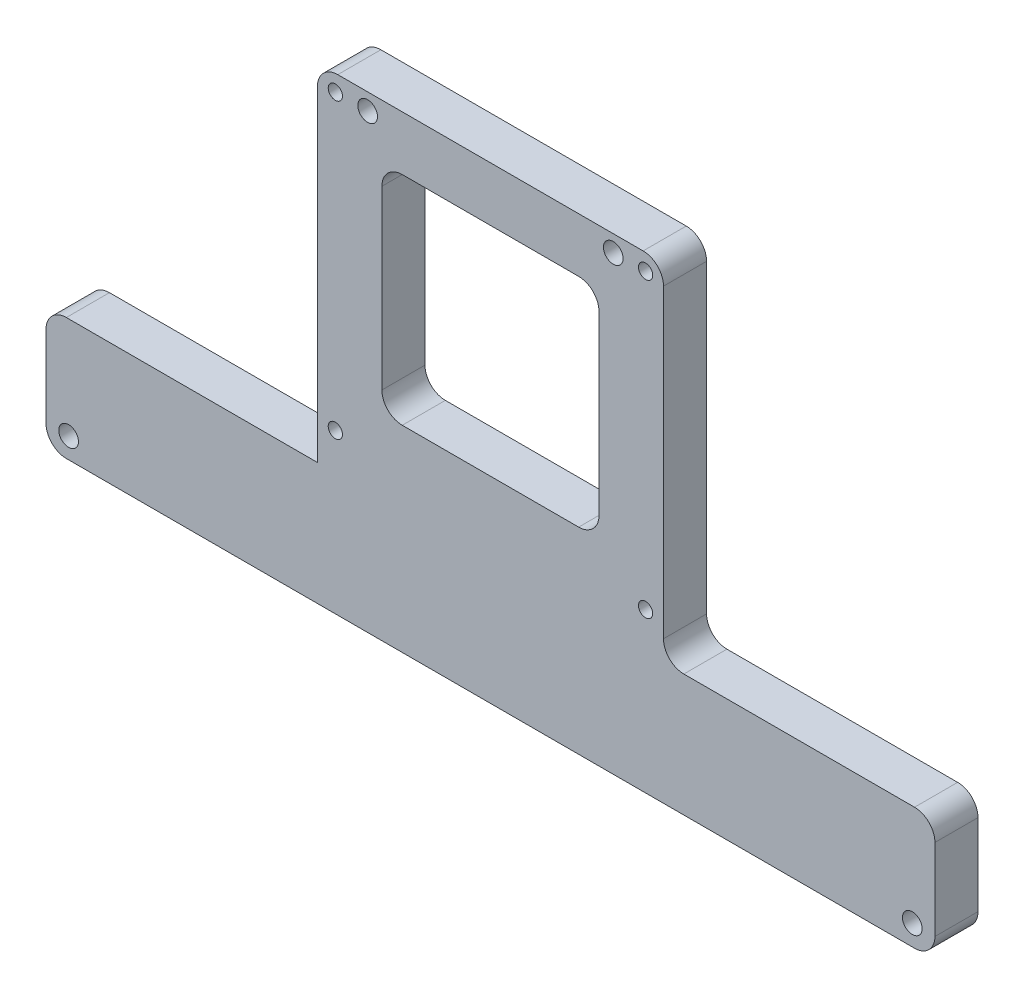
ISO-10303-21;
HEADER;
FILE_DESCRIPTION(('STEP AP214'),'2;1');
FILE_NAME('part.step','',(''),(''),'','','');
FILE_SCHEMA(('AUTOMOTIVE_DESIGN { 1 0 10303 214 1 1 1 1 }'));
ENDSEC;
DATA;
#1=APPLICATION_CONTEXT('core data for automotive mechanical design processes');
#2=APPLICATION_PROTOCOL_DEFINITION('international standard','automotive_design',2000,#1);
#3=PRODUCT_CONTEXT('',#1,'mechanical');
#4=PRODUCT('Part','Part','',(#3));
#5=PRODUCT_RELATED_PRODUCT_CATEGORY('part','',(#4));
#6=PRODUCT_DEFINITION_FORMATION('','',#4);
#7=PRODUCT_DEFINITION_CONTEXT('part definition',#1,'design');
#8=PRODUCT_DEFINITION('design','',#6,#7);
#9=PRODUCT_DEFINITION_SHAPE('','',#8);
#10=(LENGTH_UNIT() NAMED_UNIT(*) SI_UNIT(.MILLI.,.METRE.));
#11=(NAMED_UNIT(*) PLANE_ANGLE_UNIT() SI_UNIT($,.RADIAN.));
#12=(NAMED_UNIT(*) SI_UNIT($,.STERADIAN.) SOLID_ANGLE_UNIT());
#13=UNCERTAINTY_MEASURE_WITH_UNIT(LENGTH_MEASURE(1.E-05),#10,'distance_accuracy_value','');
#14=(GEOMETRIC_REPRESENTATION_CONTEXT(3) GLOBAL_UNCERTAINTY_ASSIGNED_CONTEXT((#13)) GLOBAL_UNIT_ASSIGNED_CONTEXT((#10,
#11,#12)) REPRESENTATION_CONTEXT('',''));
#15=CARTESIAN_POINT('',(0.,0.,0.));
#16=DIRECTION('',(0.,0.,1.));
#17=DIRECTION('',(1.,0.,0.));
#18=AXIS2_PLACEMENT_3D('',#15,#16,#17);
#19=CARTESIAN_POINT('',(65.5,61.,6.35));
#20=DIRECTION('',(0.,-1.,0.));
#21=DIRECTION('',(1.,0.,0.));
#22=AXIS2_PLACEMENT_3D('',#19,#20,#21);
#23=PLANE('',#22);
#24=DIRECTION('',(-1.,0.,0.));
#25=VECTOR('',#24,1.);
#26=CARTESIAN_POINT('',(65.5,61.,6.35));
#27=LINE('',#26,#25);
#28=CARTESIAN_POINT('',(78.5,61.,6.35));
#29=VERTEX_POINT('',#28);
#30=CARTESIAN_POINT('',(52.5,61.,6.35));
#31=VERTEX_POINT('',#30);
#32=EDGE_CURVE('E26',#29,#31,#27,.T.);
#33=ORIENTED_EDGE('',*,*,#32,.T.);
#34=DIRECTION('',(0.,0.,-1.));
#35=VECTOR('',#34,1.);
#36=CARTESIAN_POINT('',(52.5,61.,0.));
#37=LINE('',#36,#35);
#38=CARTESIAN_POINT('',(52.5,61.,0.));
#39=VERTEX_POINT('',#38);
#40=EDGE_CURVE('E202',#31,#39,#37,.T.);
#41=ORIENTED_EDGE('',*,*,#40,.T.);
#42=DIRECTION('',(-1.,0.,0.));
#43=VECTOR('',#42,1.);
#44=CARTESIAN_POINT('',(65.5,61.,0.));
#45=LINE('',#44,#43);
#46=CARTESIAN_POINT('',(78.5,61.,0.));
#47=VERTEX_POINT('',#46);
#48=EDGE_CURVE('E910',#47,#39,#45,.T.);
#49=ORIENTED_EDGE('',*,*,#48,.F.);
#50=DIRECTION('',(0.,0.,-1.));
#51=VECTOR('',#50,1.);
#52=CARTESIAN_POINT('',(78.5,61.,6.35));
#53=LINE('',#52,#51);
#54=EDGE_CURVE('E572',#47,#29,#53,.F.);
#55=ORIENTED_EDGE('',*,*,#54,.T.);
#56=EDGE_LOOP('',(#33,#41,#49,#55));
#57=FACE_BOUND('',#56,.T.);
#58=ADVANCED_FACE('F19',(#57),#23,.T.);
#59=CARTESIAN_POINT('',(81.5,45.,6.35));
#60=DIRECTION('',(1.,0.,0.));
#61=DIRECTION('',(0.,1.,0.));
#62=AXIS2_PLACEMENT_3D('',#59,#60,#61);
#63=PLANE('',#62);
#64=DIRECTION('',(0.,-1.,0.));
#65=VECTOR('',#64,1.);
#66=CARTESIAN_POINT('',(81.5,45.,0.));
#67=LINE('',#66,#65);
#68=CARTESIAN_POINT('',(81.5,58.,0.));
#69=VERTEX_POINT('',#68);
#70=CARTESIAN_POINT('',(81.5,32.,0.));
#71=VERTEX_POINT('',#70);
#72=EDGE_CURVE('E562',#69,#71,#67,.T.);
#73=ORIENTED_EDGE('',*,*,#72,.T.);
#74=DIRECTION('',(0.,0.,-1.));
#75=VECTOR('',#74,1.);
#76=CARTESIAN_POINT('',(81.5,32.,6.35));
#77=LINE('',#76,#75);
#78=CARTESIAN_POINT('',(81.5,32.,6.35));
#79=VERTEX_POINT('',#78);
#80=EDGE_CURVE('E573',#71,#79,#77,.F.);
#81=ORIENTED_EDGE('',*,*,#80,.T.);
#82=DIRECTION('',(0.,-1.,0.));
#83=VECTOR('',#82,1.);
#84=CARTESIAN_POINT('',(81.5,45.,6.35));
#85=LINE('',#84,#83);
#86=CARTESIAN_POINT('',(81.5,58.,6.35));
#87=VERTEX_POINT('',#86);
#88=EDGE_CURVE('E892',#87,#79,#85,.T.);
#89=ORIENTED_EDGE('',*,*,#88,.F.);
#90=DIRECTION('',(0.,0.,-1.));
#91=VECTOR('',#90,1.);
#92=CARTESIAN_POINT('',(81.5,58.,6.35));
#93=LINE('',#92,#91);
#94=EDGE_CURVE('E578',#87,#69,#93,.T.);
#95=ORIENTED_EDGE('',*,*,#94,.T.);
#96=EDGE_LOOP('',(#73,#81,#89,#95));
#97=FACE_BOUND('',#96,.T.);
#98=ADVANCED_FACE('F1241',(#97),#63,.F.);
#99=CARTESIAN_POINT('',(65.5,29.,6.35));
#100=DIRECTION('',(0.,-1.,0.));
#101=DIRECTION('',(1.,0.,0.));
#102=AXIS2_PLACEMENT_3D('',#99,#100,#101);
#103=PLANE('',#102);
#104=DIRECTION('',(-1.,0.,0.));
#105=VECTOR('',#104,1.);
#106=CARTESIAN_POINT('',(65.5,29.,0.));
#107=LINE('',#106,#105);
#108=CARTESIAN_POINT('',(78.5,29.,0.));
#109=VERTEX_POINT('',#108);
#110=CARTESIAN_POINT('',(52.5,29.,0.));
#111=VERTEX_POINT('',#110);
#112=EDGE_CURVE('E610',#109,#111,#107,.T.);
#113=ORIENTED_EDGE('',*,*,#112,.T.);
#114=DIRECTION('',(0.,0.,-1.));
#115=VECTOR('',#114,1.);
#116=CARTESIAN_POINT('',(52.5,29.,6.35));
#117=LINE('',#116,#115);
#118=CARTESIAN_POINT('',(52.5,29.,6.35));
#119=VERTEX_POINT('',#118);
#120=EDGE_CURVE('E607',#111,#119,#117,.F.);
#121=ORIENTED_EDGE('',*,*,#120,.T.);
#122=DIRECTION('',(-1.,0.,0.));
#123=VECTOR('',#122,1.);
#124=CARTESIAN_POINT('',(65.5,29.,6.35));
#125=LINE('',#124,#123);
#126=CARTESIAN_POINT('',(78.5,29.,6.35));
#127=VERTEX_POINT('',#126);
#128=EDGE_CURVE('E611',#127,#119,#125,.T.);
#129=ORIENTED_EDGE('',*,*,#128,.F.);
#130=DIRECTION('',(0.,0.,-1.));
#131=VECTOR('',#130,1.);
#132=CARTESIAN_POINT('',(78.5,29.,0.));
#133=LINE('',#132,#131);
#134=EDGE_CURVE('E442',#127,#109,#133,.T.);
#135=ORIENTED_EDGE('',*,*,#134,.T.);
#136=EDGE_LOOP('',(#113,#121,#129,#135));
#137=FACE_BOUND('',#136,.T.);
#138=ADVANCED_FACE('F1230',(#137),#103,.F.);
#139=CARTESIAN_POINT('',(111.,18.,6.35));
#140=DIRECTION('',(0.,1.,0.));
#141=DIRECTION('',(0.,0.,1.));
#142=AXIS2_PLACEMENT_3D('',#139,#140,#141);
#143=PLANE('',#142);
#144=DIRECTION('',(1.,0.,0.));
#145=VECTOR('',#144,1.);
#146=CARTESIAN_POINT('',(111.,18.,6.35));
#147=LINE('',#146,#145);
#148=CARTESIAN_POINT('',(94.,18.,6.35));
#149=VERTEX_POINT('',#148);
#150=CARTESIAN_POINT('',(128.,18.,6.35));
#151=VERTEX_POINT('',#150);
#152=EDGE_CURVE('E438',#149,#151,#147,.T.);
#153=ORIENTED_EDGE('',*,*,#152,.T.);
#154=DIRECTION('',(0.,0.,-1.));
#155=VECTOR('',#154,1.);
#156=CARTESIAN_POINT('',(128.,18.,0.));
#157=LINE('',#156,#155);
#158=CARTESIAN_POINT('',(128.,18.,0.));
#159=VERTEX_POINT('',#158);
#160=EDGE_CURVE('E377',#151,#159,#157,.T.);
#161=ORIENTED_EDGE('',*,*,#160,.T.);
#162=DIRECTION('',(1.,0.,0.));
#163=VECTOR('',#162,1.);
#164=CARTESIAN_POINT('',(111.,18.,0.));
#165=LINE('',#164,#163);
#166=CARTESIAN_POINT('',(94.,18.,0.));
#167=VERTEX_POINT('',#166);
#168=EDGE_CURVE('E371',#167,#159,#165,.T.);
#169=ORIENTED_EDGE('',*,*,#168,.F.);
#170=DIRECTION('',(0.,0.,-1.));
#171=VECTOR('',#170,1.);
#172=CARTESIAN_POINT('',(94.,18.,6.35));
#173=LINE('',#172,#171);
#174=EDGE_CURVE('E378',#167,#149,#173,.F.);
#175=ORIENTED_EDGE('',*,*,#174,.T.);
#176=EDGE_LOOP('',(#153,#161,#169,#175));
#177=FACE_BOUND('',#176,.T.);
#178=ADVANCED_FACE('F1219',(#177),#143,.T.);
#179=CARTESIAN_POINT('',(91.,23.5,6.35));
#180=DIRECTION('',(1.,0.,0.));
#181=DIRECTION('',(0.,0.,-1.));
#182=AXIS2_PLACEMENT_3D('',#179,#180,#181);
#183=PLANE('',#182);
#184=DIRECTION('',(0.,-1.,0.));
#185=VECTOR('',#184,1.);
#186=CARTESIAN_POINT('',(91.,23.5,6.35));
#187=LINE('',#186,#185);
#188=CARTESIAN_POINT('',(91.,66.,6.35));
#189=VERTEX_POINT('',#188);
#190=CARTESIAN_POINT('',(91.,21.,6.35));
#191=VERTEX_POINT('',#190);
#192=EDGE_CURVE('E446',#189,#191,#187,.T.);
#193=ORIENTED_EDGE('',*,*,#192,.T.);
#194=DIRECTION('',(0.,0.,-1.));
#195=VECTOR('',#194,1.);
#196=CARTESIAN_POINT('',(91.,21.,0.));
#197=LINE('',#196,#195);
#198=CARTESIAN_POINT('',(91.,21.,0.));
#199=VERTEX_POINT('',#198);
#200=EDGE_CURVE('E449',#191,#199,#197,.T.);
#201=ORIENTED_EDGE('',*,*,#200,.T.);
#202=DIRECTION('',(0.,-1.,0.));
#203=VECTOR('',#202,1.);
#204=CARTESIAN_POINT('',(91.,23.5,0.));
#205=LINE('',#204,#203);
#206=CARTESIAN_POINT('',(91.,66.,0.));
#207=VERTEX_POINT('',#206);
#208=EDGE_CURVE('E467',#207,#199,#205,.T.);
#209=ORIENTED_EDGE('',*,*,#208,.F.);
#210=DIRECTION('',(0.,0.,-1.));
#211=VECTOR('',#210,1.);
#212=CARTESIAN_POINT('',(91.,66.,6.35));
#213=LINE('',#212,#211);
#214=EDGE_CURVE('E464',#207,#189,#213,.F.);
#215=ORIENTED_EDGE('',*,*,#214,.T.);
#216=EDGE_LOOP('',(#193,#201,#209,#215));
#217=FACE_BOUND('',#216,.T.);
#218=ADVANCED_FACE('F1208',(#217),#183,.T.);
#219=CARTESIAN_POINT('',(65.5,69.,6.35));
#220=DIRECTION('',(0.,1.,0.));
#221=DIRECTION('',(-1.,0.,0.));
#222=AXIS2_PLACEMENT_3D('',#219,#220,#221);
#223=PLANE('',#222);
#224=DIRECTION('',(1.,0.,0.));
#225=VECTOR('',#224,1.);
#226=CARTESIAN_POINT('',(65.5,69.,6.35));
#227=LINE('',#226,#225);
#228=CARTESIAN_POINT('',(43.,69.,6.35));
#229=VERTEX_POINT('',#228);
#230=CARTESIAN_POINT('',(88.,69.,6.35));
#231=VERTEX_POINT('',#230);
#232=EDGE_CURVE('E458',#229,#231,#227,.T.);
#233=ORIENTED_EDGE('',*,*,#232,.T.);
#234=DIRECTION('',(0.,0.,-1.));
#235=VECTOR('',#234,1.);
#236=CARTESIAN_POINT('',(88.,69.,6.35));
#237=LINE('',#236,#235);
#238=CARTESIAN_POINT('',(88.,69.,0.));
#239=VERTEX_POINT('',#238);
#240=EDGE_CURVE('E455',#231,#239,#237,.T.);
#241=ORIENTED_EDGE('',*,*,#240,.T.);
#242=DIRECTION('',(1.,0.,0.));
#243=VECTOR('',#242,1.);
#244=CARTESIAN_POINT('',(65.5,69.,0.));
#245=LINE('',#244,#243);
#246=CARTESIAN_POINT('',(43.,69.,0.));
#247=VERTEX_POINT('',#246);
#248=EDGE_CURVE('E459',#247,#239,#245,.T.);
#249=ORIENTED_EDGE('',*,*,#248,.F.);
#250=DIRECTION('',(0.,0.,-1.));
#251=VECTOR('',#250,1.);
#252=CARTESIAN_POINT('',(43.,69.,6.35));
#253=LINE('',#252,#251);
#254=EDGE_CURVE('E354',#247,#229,#253,.F.);
#255=ORIENTED_EDGE('',*,*,#254,.T.);
#256=EDGE_LOOP('',(#233,#241,#249,#255));
#257=FACE_BOUND('',#256,.T.);
#258=ADVANCED_FACE('F1198',(#257),#223,.T.);
#259=CARTESIAN_POINT('',(40.,23.5,6.35));
#260=DIRECTION('',(1.,0.,0.));
#261=DIRECTION('',(0.,0.,-1.));
#262=AXIS2_PLACEMENT_3D('',#259,#260,#261);
#263=PLANE('',#262);
#264=DIRECTION('',(0.,-1.,0.));
#265=VECTOR('',#264,1.);
#266=CARTESIAN_POINT('',(40.,23.5,6.35));
#267=LINE('',#266,#265);
#268=CARTESIAN_POINT('',(40.,66.,6.35));
#269=VERTEX_POINT('',#268);
#270=CARTESIAN_POINT('',(40.,18.,6.35));
#271=VERTEX_POINT('',#270);
#272=EDGE_CURVE('E347',#269,#271,#267,.T.);
#273=ORIENTED_EDGE('',*,*,#272,.F.);
#274=DIRECTION('',(0.,0.,-1.));
#275=VECTOR('',#274,1.);
#276=CARTESIAN_POINT('',(40.,66.,0.));
#277=LINE('',#276,#275);
#278=CARTESIAN_POINT('',(40.,66.,0.));
#279=VERTEX_POINT('',#278);
#280=EDGE_CURVE('E343',#269,#279,#277,.T.);
#281=ORIENTED_EDGE('',*,*,#280,.T.);
#282=DIRECTION('',(0.,-1.,0.));
#283=VECTOR('',#282,1.);
#284=CARTESIAN_POINT('',(40.,23.5,0.));
#285=LINE('',#284,#283);
#286=CARTESIAN_POINT('',(40.,18.,0.));
#287=VERTEX_POINT('',#286);
#288=EDGE_CURVE('E40',#279,#287,#285,.T.);
#289=ORIENTED_EDGE('',*,*,#288,.T.);
#290=DIRECTION('',(0.,0.,1.));
#291=VECTOR('',#290,1.);
#292=CARTESIAN_POINT('',(40.,18.,6.35));
#293=LINE('',#292,#291);
#294=EDGE_CURVE('E12',#271,#287,#293,.F.);
#295=ORIENTED_EDGE('',*,*,#294,.F.);
#296=EDGE_LOOP('',(#273,#281,#289,#295));
#297=FACE_BOUND('',#296,.T.);
#298=ADVANCED_FACE('F1188',(#297),#263,.F.);
#299=CARTESIAN_POINT('',(35.,18.,6.35));
#300=DIRECTION('',(0.,1.,0.));
#301=DIRECTION('',(-1.,0.,0.));
#302=AXIS2_PLACEMENT_3D('',#299,#300,#301);
#303=PLANE('',#302);
#304=DIRECTION('',(1.,0.,0.));
#305=VECTOR('',#304,1.);
#306=CARTESIAN_POINT('',(35.,18.,6.35));
#307=LINE('',#306,#305);
#308=CARTESIAN_POINT('',(3.,18.,6.35));
#309=VERTEX_POINT('',#308);
#310=EDGE_CURVE('E32',#309,#271,#307,.T.);
#311=ORIENTED_EDGE('',*,*,#310,.T.);
#312=ORIENTED_EDGE('',*,*,#294,.T.);
#313=DIRECTION('',(1.,0.,0.));
#314=VECTOR('',#313,1.);
#315=CARTESIAN_POINT('',(35.,18.,0.));
#316=LINE('',#315,#314);
#317=CARTESIAN_POINT('',(3.,18.,0.));
#318=VERTEX_POINT('',#317);
#319=EDGE_CURVE('E363',#318,#287,#316,.T.);
#320=ORIENTED_EDGE('',*,*,#319,.F.);
#321=DIRECTION('',(0.,0.,-1.));
#322=VECTOR('',#321,1.);
#323=CARTESIAN_POINT('',(3.,18.,6.35));
#324=LINE('',#323,#322);
#325=EDGE_CURVE('E309',#318,#309,#324,.F.);
#326=ORIENTED_EDGE('',*,*,#325,.T.);
#327=EDGE_LOOP('',(#311,#312,#320,#326));
#328=FACE_BOUND('',#327,.T.);
#329=ADVANCED_FACE('F1177',(#328),#303,.T.);
#330=CARTESIAN_POINT('',(0.,9.,6.35));
#331=DIRECTION('',(-1.,0.,0.));
#332=DIRECTION('',(0.,0.,1.));
#333=AXIS2_PLACEMENT_3D('',#330,#331,#332);
#334=PLANE('',#333);
#335=DIRECTION('',(0.,1.,0.));
#336=VECTOR('',#335,1.);
#337=CARTESIAN_POINT('',(0.,9.,6.35));
#338=LINE('',#337,#336);
#339=CARTESIAN_POINT('',(0.,3.,6.35));
#340=VERTEX_POINT('',#339);
#341=CARTESIAN_POINT('',(0.,15.,6.35));
#342=VERTEX_POINT('',#341);
#343=EDGE_CURVE('E304',#340,#342,#338,.T.);
#344=ORIENTED_EDGE('',*,*,#343,.T.);
#345=DIRECTION('',(0.,0.,-1.));
#346=VECTOR('',#345,1.);
#347=CARTESIAN_POINT('',(0.,15.,6.35));
#348=LINE('',#347,#346);
#349=CARTESIAN_POINT('',(0.,15.,0.));
#350=VERTEX_POINT('',#349);
#351=EDGE_CURVE('E310',#342,#350,#348,.T.);
#352=ORIENTED_EDGE('',*,*,#351,.T.);
#353=DIRECTION('',(0.,1.,0.));
#354=VECTOR('',#353,1.);
#355=CARTESIAN_POINT('',(0.,9.,0.));
#356=LINE('',#355,#354);
#357=CARTESIAN_POINT('',(0.,3.,0.));
#358=VERTEX_POINT('',#357);
#359=EDGE_CURVE('E800',#358,#350,#356,.T.);
#360=ORIENTED_EDGE('',*,*,#359,.F.);
#361=DIRECTION('',(0.,0.,-1.));
#362=VECTOR('',#361,1.);
#363=CARTESIAN_POINT('',(0.,3.,6.35));
#364=LINE('',#363,#362);
#365=EDGE_CURVE('E795',#358,#340,#364,.F.);
#366=ORIENTED_EDGE('',*,*,#365,.T.);
#367=EDGE_LOOP('',(#344,#352,#360,#366));
#368=FACE_BOUND('',#367,.T.);
#369=ADVANCED_FACE('F1166',(#368),#334,.T.);
#370=CARTESIAN_POINT('',(65.5,0.,6.35));
#371=DIRECTION('',(0.,1.,0.));
#372=DIRECTION('',(0.,0.,1.));
#373=AXIS2_PLACEMENT_3D('',#370,#371,#372);
#374=PLANE('',#373);
#375=DIRECTION('',(1.,0.,0.));
#376=VECTOR('',#375,1.);
#377=CARTESIAN_POINT('',(65.5,0.,0.));
#378=LINE('',#377,#376);
#379=CARTESIAN_POINT('',(3.,0.,0.));
#380=VERTEX_POINT('',#379);
#381=CARTESIAN_POINT('',(128.,0.,0.));
#382=VERTEX_POINT('',#381);
#383=EDGE_CURVE('E790',#380,#382,#378,.T.);
#384=ORIENTED_EDGE('',*,*,#383,.T.);
#385=DIRECTION('',(0.,0.,-1.));
#386=VECTOR('',#385,1.);
#387=CARTESIAN_POINT('',(128.,0.,6.35));
#388=LINE('',#387,#386);
#389=CARTESIAN_POINT('',(128.,0.,6.35));
#390=VERTEX_POINT('',#389);
#391=EDGE_CURVE('E295',#382,#390,#388,.F.);
#392=ORIENTED_EDGE('',*,*,#391,.T.);
#393=DIRECTION('',(1.,0.,0.));
#394=VECTOR('',#393,1.);
#395=CARTESIAN_POINT('',(65.5,0.,6.35));
#396=LINE('',#395,#394);
#397=CARTESIAN_POINT('',(3.,0.,6.35));
#398=VERTEX_POINT('',#397);
#399=EDGE_CURVE('E289',#398,#390,#396,.T.);
#400=ORIENTED_EDGE('',*,*,#399,.F.);
#401=DIRECTION('',(0.,0.,-1.));
#402=VECTOR('',#401,1.);
#403=CARTESIAN_POINT('',(3.,0.,0.));
#404=LINE('',#403,#402);
#405=EDGE_CURVE('E296',#398,#380,#404,.T.);
#406=ORIENTED_EDGE('',*,*,#405,.T.);
#407=EDGE_LOOP('',(#384,#392,#400,#406));
#408=FACE_BOUND('',#407,.T.);
#409=ADVANCED_FACE('F1156',(#408),#374,.F.);
#410=CARTESIAN_POINT('',(131.,9.,6.35));
#411=DIRECTION('',(-1.,0.,0.));
#412=DIRECTION('',(0.,0.,1.));
#413=AXIS2_PLACEMENT_3D('',#410,#411,#412);
#414=PLANE('',#413);
#415=DIRECTION('',(0.,1.,0.));
#416=VECTOR('',#415,1.);
#417=CARTESIAN_POINT('',(131.,9.,0.));
#418=LINE('',#417,#416);
#419=CARTESIAN_POINT('',(131.,3.,0.));
#420=VERTEX_POINT('',#419);
#421=CARTESIAN_POINT('',(131.,15.,0.));
#422=VERTEX_POINT('',#421);
#423=EDGE_CURVE('E391',#420,#422,#418,.T.);
#424=ORIENTED_EDGE('',*,*,#423,.T.);
#425=DIRECTION('',(0.,0.,-1.));
#426=VECTOR('',#425,1.);
#427=CARTESIAN_POINT('',(131.,15.,6.35));
#428=LINE('',#427,#426);
#429=CARTESIAN_POINT('',(131.,15.,6.35));
#430=VERTEX_POINT('',#429);
#431=EDGE_CURVE('E256',#422,#430,#428,.F.);
#432=ORIENTED_EDGE('',*,*,#431,.T.);
#433=DIRECTION('',(0.,1.,0.));
#434=VECTOR('',#433,1.);
#435=CARTESIAN_POINT('',(131.,9.,6.35));
#436=LINE('',#435,#434);
#437=CARTESIAN_POINT('',(131.,3.,6.35));
#438=VERTEX_POINT('',#437);
#439=EDGE_CURVE('E249',#438,#430,#436,.T.);
#440=ORIENTED_EDGE('',*,*,#439,.F.);
#441=DIRECTION('',(0.,0.,-1.));
#442=VECTOR('',#441,1.);
#443=CARTESIAN_POINT('',(131.,3.,6.35));
#444=LINE('',#443,#442);
#445=EDGE_CURVE('E198',#438,#420,#444,.T.);
#446=ORIENTED_EDGE('',*,*,#445,.T.);
#447=EDGE_LOOP('',(#424,#432,#440,#446));
#448=FACE_BOUND('',#447,.T.);
#449=ADVANCED_FACE('F405',(#448),#414,.F.);
#450=CARTESIAN_POINT('',(49.5,45.,6.35));
#451=DIRECTION('',(1.,0.,0.));
#452=DIRECTION('',(0.,1.,0.));
#453=AXIS2_PLACEMENT_3D('',#450,#451,#452);
#454=PLANE('',#453);
#455=DIRECTION('',(0.,-1.,0.));
#456=VECTOR('',#455,1.);
#457=CARTESIAN_POINT('',(49.5,45.,6.35));
#458=LINE('',#457,#456);
#459=CARTESIAN_POINT('',(49.5,58.,6.35));
#460=VERTEX_POINT('',#459);
#461=CARTESIAN_POINT('',(49.5,32.,6.35));
#462=VERTEX_POINT('',#461);
#463=EDGE_CURVE('E176',#460,#462,#458,.T.);
#464=ORIENTED_EDGE('',*,*,#463,.T.);
#465=DIRECTION('',(0.,0.,-1.));
#466=VECTOR('',#465,1.);
#467=CARTESIAN_POINT('',(49.5,32.,6.35));
#468=LINE('',#467,#466);
#469=CARTESIAN_POINT('',(49.5,32.,0.));
#470=VERTEX_POINT('',#469);
#471=EDGE_CURVE('E199',#462,#470,#468,.T.);
#472=ORIENTED_EDGE('',*,*,#471,.T.);
#473=DIRECTION('',(0.,-1.,0.));
#474=VECTOR('',#473,1.);
#475=CARTESIAN_POINT('',(49.5,45.,0.));
#476=LINE('',#475,#474);
#477=CARTESIAN_POINT('',(49.5,58.,0.));
#478=VERTEX_POINT('',#477);
#479=EDGE_CURVE('E179',#478,#470,#476,.T.);
#480=ORIENTED_EDGE('',*,*,#479,.F.);
#481=DIRECTION('',(0.,0.,-1.));
#482=VECTOR('',#481,1.);
#483=CARTESIAN_POINT('',(49.5,58.,6.35));
#484=LINE('',#483,#482);
#485=EDGE_CURVE('E173',#478,#460,#484,.F.);
#486=ORIENTED_EDGE('',*,*,#485,.T.);
#487=EDGE_LOOP('',(#464,#472,#480,#486));
#488=FACE_BOUND('',#487,.T.);
#489=ADVANCED_FACE('F175',(#488),#454,.T.);
#490=CARTESIAN_POINT('',(65.5,45.,6.35));
#491=DIRECTION('',(0.,0.,1.));
#492=DIRECTION('',(1.,0.,0.));
#493=AXIS2_PLACEMENT_3D('',#490,#491,#492);
#494=PLANE('',#493);
#495=CARTESIAN_POINT('',(42.64,23.41,6.35));
#496=DIRECTION('',(0.,0.,-1.));
#497=DIRECTION('',(-1.,0.,0.));
#498=AXIS2_PLACEMENT_3D('',#495,#496,#497);
#499=CIRCLE('',#498,1.05);
#500=CARTESIAN_POINT('',(41.59,23.41,6.35));
#501=VERTEX_POINT('',#500);
#502=EDGE_CURVE('E185',#501,#501,#499,.T.);
#503=ORIENTED_EDGE('',*,*,#502,.T.);
#504=EDGE_LOOP('',(#503));
#505=FACE_BOUND('',#504,.T.);
#506=CARTESIAN_POINT('',(88.36,23.41,6.35));
#507=DIRECTION('',(0.,0.,-1.));
#508=DIRECTION('',(-1.,0.,0.));
#509=AXIS2_PLACEMENT_3D('',#506,#507,#508);
#510=CIRCLE('',#509,1.05);
#511=CARTESIAN_POINT('',(87.31,23.41,6.35));
#512=VERTEX_POINT('',#511);
#513=EDGE_CURVE('E750',#512,#512,#510,.T.);
#514=ORIENTED_EDGE('',*,*,#513,.T.);
#515=EDGE_LOOP('',(#514));
#516=FACE_BOUND('',#515,.T.);
#517=CARTESIAN_POINT('',(88.36,66.59,6.35));
#518=DIRECTION('',(0.,0.,-1.));
#519=DIRECTION('',(-1.,0.,0.));
#520=AXIS2_PLACEMENT_3D('',#517,#518,#519);
#521=CIRCLE('',#520,1.05);
#522=CARTESIAN_POINT('',(87.31,66.59,6.35));
#523=VERTEX_POINT('',#522);
#524=EDGE_CURVE('E743',#523,#523,#521,.T.);
#525=ORIENTED_EDGE('',*,*,#524,.T.);
#526=EDGE_LOOP('',(#525));
#527=FACE_BOUND('',#526,.T.);
#528=CARTESIAN_POINT('',(42.64,66.59,6.35));
#529=DIRECTION('',(0.,0.,-1.));
#530=DIRECTION('',(-1.,0.,0.));
#531=AXIS2_PLACEMENT_3D('',#528,#529,#530);
#532=CIRCLE('',#531,1.05);
#533=CARTESIAN_POINT('',(41.59,66.59,6.35));
#534=VERTEX_POINT('',#533);
#535=EDGE_CURVE('E736',#534,#534,#532,.T.);
#536=ORIENTED_EDGE('',*,*,#535,.T.);
#537=EDGE_LOOP('',(#536));
#538=FACE_BOUND('',#537,.T.);
#539=CARTESIAN_POINT('',(127.6685,3.047,6.35));
#540=DIRECTION('',(0.,0.,-1.));
#541=DIRECTION('',(-1.,0.,0.));
#542=AXIS2_PLACEMENT_3D('',#539,#540,#541);
#543=CIRCLE('',#542,1.45);
#544=CARTESIAN_POINT('',(126.2185,3.047,6.35));
#545=VERTEX_POINT('',#544);
#546=EDGE_CURVE('E729',#545,#545,#543,.T.);
#547=ORIENTED_EDGE('',*,*,#546,.T.);
#548=EDGE_LOOP('',(#547));
#549=FACE_BOUND('',#548,.T.);
#550=CARTESIAN_POINT('',(3.3315,3.047,6.35));
#551=DIRECTION('',(0.,0.,-1.));
#552=DIRECTION('',(-1.,0.,0.));
#553=AXIS2_PLACEMENT_3D('',#550,#551,#552);
#554=CIRCLE('',#553,1.45);
#555=CARTESIAN_POINT('',(1.8815,3.047,6.35));
#556=VERTEX_POINT('',#555);
#557=EDGE_CURVE('E723',#556,#556,#554,.T.);
#558=ORIENTED_EDGE('',*,*,#557,.T.);
#559=EDGE_LOOP('',(#558));
#560=FACE_BOUND('',#559,.T.);
#561=CARTESIAN_POINT('',(47.4000774775177,66.5501640573376,6.35));
#562=DIRECTION('',(0.,0.,-1.));
#563=DIRECTION('',(-1.,0.,0.));
#564=AXIS2_PLACEMENT_3D('',#561,#562,#563);
#565=CIRCLE('',#564,1.45);
#566=CARTESIAN_POINT('',(45.9500774775177,66.5501640573376,6.35));
#567=VERTEX_POINT('',#566);
#568=EDGE_CURVE('E426',#567,#567,#565,.T.);
#569=ORIENTED_EDGE('',*,*,#568,.T.);
#570=EDGE_LOOP('',(#569));
#571=FACE_BOUND('',#570,.T.);
#572=CARTESIAN_POINT('',(83.6000774775175,66.5501640573376,6.35));
#573=DIRECTION('',(0.,0.,-1.));
#574=DIRECTION('',(-1.,0.,0.));
#575=AXIS2_PLACEMENT_3D('',#572,#573,#574);
#576=CIRCLE('',#575,1.45);
#577=CARTESIAN_POINT('',(82.1500774775175,66.5501640573376,6.35));
#578=VERTEX_POINT('',#577);
#579=EDGE_CURVE('E418',#578,#578,#576,.T.);
#580=ORIENTED_EDGE('',*,*,#579,.T.);
#581=EDGE_LOOP('',(#580));
#582=FACE_BOUND('',#581,.T.);
#583=ORIENTED_EDGE('',*,*,#439,.T.);
#584=CARTESIAN_POINT('',(128.,15.,6.35));
#585=DIRECTION('',(0.,0.,1.));
#586=DIRECTION('',(1.,0.,0.));
#587=AXIS2_PLACEMENT_3D('',#584,#585,#586);
#588=CIRCLE('',#587,3.);
#589=EDGE_CURVE('E412',#430,#151,#588,.T.);
#590=ORIENTED_EDGE('',*,*,#589,.T.);
#591=ORIENTED_EDGE('',*,*,#152,.F.);
#592=CARTESIAN_POINT('',(94.,21.,6.35));
#593=DIRECTION('',(0.,0.,1.));
#594=DIRECTION('',(1.,0.,0.));
#595=AXIS2_PLACEMENT_3D('',#592,#593,#594);
#596=CIRCLE('',#595,3.);
#597=EDGE_CURVE('E419',#149,#191,#596,.F.);
#598=ORIENTED_EDGE('',*,*,#597,.T.);
#599=ORIENTED_EDGE('',*,*,#192,.F.);
#600=CARTESIAN_POINT('',(88.,66.,6.35));
#601=DIRECTION('',(0.,0.,1.));
#602=DIRECTION('',(1.,0.,0.));
#603=AXIS2_PLACEMENT_3D('',#600,#601,#602);
#604=CIRCLE('',#603,3.);
#605=EDGE_CURVE('E333',#189,#231,#604,.T.);
#606=ORIENTED_EDGE('',*,*,#605,.T.);
#607=ORIENTED_EDGE('',*,*,#232,.F.);
#608=CARTESIAN_POINT('',(43.,66.,6.35));
#609=DIRECTION('',(0.,0.,1.));
#610=DIRECTION('',(1.,0.,0.));
#611=AXIS2_PLACEMENT_3D('',#608,#609,#610);
#612=CIRCLE('',#611,3.);
#613=EDGE_CURVE('E327',#229,#269,#612,.T.);
#614=ORIENTED_EDGE('',*,*,#613,.T.);
#615=ORIENTED_EDGE('',*,*,#272,.T.);
#616=ORIENTED_EDGE('',*,*,#310,.F.);
#617=CARTESIAN_POINT('',(3.,15.,6.35));
#618=DIRECTION('',(0.,0.,1.));
#619=DIRECTION('',(1.,0.,0.));
#620=AXIS2_PLACEMENT_3D('',#617,#618,#619);
#621=CIRCLE('',#620,3.);
#622=EDGE_CURVE('E322',#309,#342,#621,.T.);
#623=ORIENTED_EDGE('',*,*,#622,.T.);
#624=ORIENTED_EDGE('',*,*,#343,.F.);
#625=CARTESIAN_POINT('',(3.,3.,6.35));
#626=DIRECTION('',(0.,0.,1.));
#627=DIRECTION('',(1.,0.,0.));
#628=AXIS2_PLACEMENT_3D('',#625,#626,#627);
#629=CIRCLE('',#628,3.);
#630=EDGE_CURVE('E230',#340,#398,#629,.T.);
#631=ORIENTED_EDGE('',*,*,#630,.T.);
#632=ORIENTED_EDGE('',*,*,#399,.T.);
#633=CARTESIAN_POINT('',(128.,3.,6.35));
#634=DIRECTION('',(0.,0.,1.));
#635=DIRECTION('',(1.,0.,0.));
#636=AXIS2_PLACEMENT_3D('',#633,#634,#635);
#637=CIRCLE('',#636,3.);
#638=EDGE_CURVE('E225',#390,#438,#637,.T.);
#639=ORIENTED_EDGE('',*,*,#638,.T.);
#640=EDGE_LOOP('',(#583,#590,#591,#598,#599,#606,#607,#614,#615,#616,#623,#624,#631,#632,#639));
#641=FACE_BOUND('',#640,.T.);
#642=ORIENTED_EDGE('',*,*,#32,.F.);
#643=CARTESIAN_POINT('',(78.5,58.,6.35));
#644=DIRECTION('',(0.,0.,1.));
#645=DIRECTION('',(1.,0.,0.));
#646=AXIS2_PLACEMENT_3D('',#643,#644,#645);
#647=CIRCLE('',#646,3.);
#648=EDGE_CURVE('E221',#29,#87,#647,.F.);
#649=ORIENTED_EDGE('',*,*,#648,.T.);
#650=ORIENTED_EDGE('',*,*,#88,.T.);
#651=CARTESIAN_POINT('',(78.5,32.,6.35));
#652=DIRECTION('',(0.,0.,1.));
#653=DIRECTION('',(1.,0.,0.));
#654=AXIS2_PLACEMENT_3D('',#651,#652,#653);
#655=CIRCLE('',#654,3.);
#656=EDGE_CURVE('E211',#79,#127,#655,.F.);
#657=ORIENTED_EDGE('',*,*,#656,.T.);
#658=ORIENTED_EDGE('',*,*,#128,.T.);
#659=CARTESIAN_POINT('',(52.5,32.,6.35));
#660=DIRECTION('',(0.,0.,1.));
#661=DIRECTION('',(1.,0.,0.));
#662=AXIS2_PLACEMENT_3D('',#659,#660,#661);
#663=CIRCLE('',#662,3.);
#664=EDGE_CURVE('E195',#119,#462,#663,.F.);
#665=ORIENTED_EDGE('',*,*,#664,.T.);
#666=ORIENTED_EDGE('',*,*,#463,.F.);
#667=CARTESIAN_POINT('',(52.5,58.,6.35));
#668=DIRECTION('',(0.,0.,1.));
#669=DIRECTION('',(1.,0.,0.));
#670=AXIS2_PLACEMENT_3D('',#667,#668,#669);
#671=CIRCLE('',#670,3.);
#672=EDGE_CURVE('E191',#460,#31,#671,.F.);
#673=ORIENTED_EDGE('',*,*,#672,.T.);
#674=EDGE_LOOP('',(#642,#649,#650,#657,#658,#665,#666,#673));
#675=FACE_BOUND('',#674,.T.);
#676=ADVANCED_FACE('F190',(#505,#516,#527,#538,#549,#560,#571,#582,#641,#675),#494,.T.);
#677=CARTESIAN_POINT('',(65.5,45.,0.));
#678=DIRECTION('',(0.,0.,1.));
#679=DIRECTION('',(1.,0.,0.));
#680=AXIS2_PLACEMENT_3D('',#677,#678,#679);
#681=PLANE('',#680);
#682=CARTESIAN_POINT('',(42.64,23.41,0.));
#683=DIRECTION('',(0.,0.,1.));
#684=DIRECTION('',(1.,0.,0.));
#685=AXIS2_PLACEMENT_3D('',#682,#683,#684);
#686=CIRCLE('',#685,1.05);
#687=CARTESIAN_POINT('',(43.69,23.41,0.));
#688=VERTEX_POINT('',#687);
#689=EDGE_CURVE('E204',#688,#688,#686,.F.);
#690=ORIENTED_EDGE('',*,*,#689,.F.);
#691=EDGE_LOOP('',(#690));
#692=FACE_BOUND('',#691,.T.);
#693=CARTESIAN_POINT('',(88.36,23.41,0.));
#694=DIRECTION('',(0.,0.,1.));
#695=DIRECTION('',(1.,0.,0.));
#696=AXIS2_PLACEMENT_3D('',#693,#694,#695);
#697=CIRCLE('',#696,1.05);
#698=CARTESIAN_POINT('',(89.41,23.41,0.));
#699=VERTEX_POINT('',#698);
#700=EDGE_CURVE('E214',#699,#699,#697,.F.);
#701=ORIENTED_EDGE('',*,*,#700,.F.);
#702=EDGE_LOOP('',(#701));
#703=FACE_BOUND('',#702,.T.);
#704=CARTESIAN_POINT('',(88.36,66.59,0.));
#705=DIRECTION('',(0.,0.,1.));
#706=DIRECTION('',(1.,0.,0.));
#707=AXIS2_PLACEMENT_3D('',#704,#705,#706);
#708=CIRCLE('',#707,1.05);
#709=CARTESIAN_POINT('',(89.41,66.59,0.));
#710=VERTEX_POINT('',#709);
#711=EDGE_CURVE('E530',#710,#710,#708,.F.);
#712=ORIENTED_EDGE('',*,*,#711,.F.);
#713=EDGE_LOOP('',(#712));
#714=FACE_BOUND('',#713,.T.);
#715=CARTESIAN_POINT('',(42.64,66.59,0.));
#716=DIRECTION('',(0.,0.,1.));
#717=DIRECTION('',(1.,0.,0.));
#718=AXIS2_PLACEMENT_3D('',#715,#716,#717);
#719=CIRCLE('',#718,1.05);
#720=CARTESIAN_POINT('',(43.69,66.59,0.));
#721=VERTEX_POINT('',#720);
#722=EDGE_CURVE('E526',#721,#721,#719,.F.);
#723=ORIENTED_EDGE('',*,*,#722,.F.);
#724=EDGE_LOOP('',(#723));
#725=FACE_BOUND('',#724,.T.);
#726=CARTESIAN_POINT('',(127.6685,3.047,0.));
#727=DIRECTION('',(0.,0.,1.));
#728=DIRECTION('',(1.,0.,0.));
#729=AXIS2_PLACEMENT_3D('',#726,#727,#728);
#730=CIRCLE('',#729,1.45);
#731=CARTESIAN_POINT('',(129.1185,3.047,0.));
#732=VERTEX_POINT('',#731);
#733=EDGE_CURVE('E522',#732,#732,#730,.F.);
#734=ORIENTED_EDGE('',*,*,#733,.F.);
#735=EDGE_LOOP('',(#734));
#736=FACE_BOUND('',#735,.T.);
#737=CARTESIAN_POINT('',(3.3315,3.047,0.));
#738=DIRECTION('',(0.,0.,1.));
#739=DIRECTION('',(1.,0.,0.));
#740=AXIS2_PLACEMENT_3D('',#737,#738,#739);
#741=CIRCLE('',#740,1.45);
#742=CARTESIAN_POINT('',(4.7815,3.047,0.));
#743=VERTEX_POINT('',#742);
#744=EDGE_CURVE('E518',#743,#743,#741,.F.);
#745=ORIENTED_EDGE('',*,*,#744,.F.);
#746=EDGE_LOOP('',(#745));
#747=FACE_BOUND('',#746,.T.);
#748=CARTESIAN_POINT('',(47.4000774775177,66.5501640573376,0.));
#749=DIRECTION('',(0.,0.,1.));
#750=DIRECTION('',(1.,0.,0.));
#751=AXIS2_PLACEMENT_3D('',#748,#749,#750);
#752=CIRCLE('',#751,1.45);
#753=CARTESIAN_POINT('',(48.8500774775177,66.5501640573376,0.));
#754=VERTEX_POINT('',#753);
#755=EDGE_CURVE('E514',#754,#754,#752,.F.);
#756=ORIENTED_EDGE('',*,*,#755,.F.);
#757=EDGE_LOOP('',(#756));
#758=FACE_BOUND('',#757,.T.);
#759=CARTESIAN_POINT('',(83.6000774775175,66.5501640573376,0.));
#760=DIRECTION('',(0.,0.,1.));
#761=DIRECTION('',(1.,0.,0.));
#762=AXIS2_PLACEMENT_3D('',#759,#760,#761);
#763=CIRCLE('',#762,1.45);
#764=CARTESIAN_POINT('',(85.0500774775175,66.5501640573376,0.));
#765=VERTEX_POINT('',#764);
#766=EDGE_CURVE('E510',#765,#765,#763,.F.);
#767=ORIENTED_EDGE('',*,*,#766,.F.);
#768=EDGE_LOOP('',(#767));
#769=FACE_BOUND('',#768,.T.);
#770=ORIENTED_EDGE('',*,*,#168,.T.);
#771=CARTESIAN_POINT('',(128.,15.,0.));
#772=DIRECTION('',(0.,0.,1.));
#773=DIRECTION('',(1.,0.,0.));
#774=AXIS2_PLACEMENT_3D('',#771,#772,#773);
#775=CIRCLE('',#774,3.);
#776=EDGE_CURVE('E507',#159,#422,#775,.F.);
#777=ORIENTED_EDGE('',*,*,#776,.T.);
#778=ORIENTED_EDGE('',*,*,#423,.F.);
#779=CARTESIAN_POINT('',(128.,3.,0.));
#780=DIRECTION('',(0.,0.,1.));
#781=DIRECTION('',(1.,0.,0.));
#782=AXIS2_PLACEMENT_3D('',#779,#780,#781);
#783=CIRCLE('',#782,3.);
#784=EDGE_CURVE('E503',#420,#382,#783,.F.);
#785=ORIENTED_EDGE('',*,*,#784,.T.);
#786=ORIENTED_EDGE('',*,*,#383,.F.);
#787=CARTESIAN_POINT('',(3.,3.,0.));
#788=DIRECTION('',(0.,0.,1.));
#789=DIRECTION('',(1.,0.,0.));
#790=AXIS2_PLACEMENT_3D('',#787,#788,#789);
#791=CIRCLE('',#790,3.);
#792=EDGE_CURVE('E499',#380,#358,#791,.F.);
#793=ORIENTED_EDGE('',*,*,#792,.T.);
#794=ORIENTED_EDGE('',*,*,#359,.T.);
#795=CARTESIAN_POINT('',(3.,15.,0.));
#796=DIRECTION('',(0.,0.,1.));
#797=DIRECTION('',(1.,0.,0.));
#798=AXIS2_PLACEMENT_3D('',#795,#796,#797);
#799=CIRCLE('',#798,3.);
#800=EDGE_CURVE('E495',#350,#318,#799,.F.);
#801=ORIENTED_EDGE('',*,*,#800,.T.);
#802=ORIENTED_EDGE('',*,*,#319,.T.);
#803=ORIENTED_EDGE('',*,*,#288,.F.);
#804=CARTESIAN_POINT('',(43.,66.,0.));
#805=DIRECTION('',(0.,0.,1.));
#806=DIRECTION('',(1.,0.,0.));
#807=AXIS2_PLACEMENT_3D('',#804,#805,#806);
#808=CIRCLE('',#807,3.);
#809=EDGE_CURVE('E491',#279,#247,#808,.F.);
#810=ORIENTED_EDGE('',*,*,#809,.T.);
#811=ORIENTED_EDGE('',*,*,#248,.T.);
#812=CARTESIAN_POINT('',(88.,66.,0.));
#813=DIRECTION('',(0.,0.,1.));
#814=DIRECTION('',(1.,0.,0.));
#815=AXIS2_PLACEMENT_3D('',#812,#813,#814);
#816=CIRCLE('',#815,3.);
#817=EDGE_CURVE('E484',#239,#207,#816,.F.);
#818=ORIENTED_EDGE('',*,*,#817,.T.);
#819=ORIENTED_EDGE('',*,*,#208,.T.);
#820=CARTESIAN_POINT('',(94.,21.,0.));
#821=DIRECTION('',(0.,0.,1.));
#822=DIRECTION('',(1.,0.,0.));
#823=AXIS2_PLACEMENT_3D('',#820,#821,#822);
#824=CIRCLE('',#823,3.);
#825=EDGE_CURVE('E478',#199,#167,#824,.T.);
#826=ORIENTED_EDGE('',*,*,#825,.T.);
#827=EDGE_LOOP('',(#770,#777,#778,#785,#786,#793,#794,#801,#802,#803,#810,#811,#818,#819,#826));
#828=FACE_BOUND('',#827,.T.);
#829=ORIENTED_EDGE('',*,*,#72,.F.);
#830=CARTESIAN_POINT('',(78.5,58.,0.));
#831=DIRECTION('',(0.,0.,1.));
#832=DIRECTION('',(1.,0.,0.));
#833=AXIS2_PLACEMENT_3D('',#830,#831,#832);
#834=CIRCLE('',#833,3.);
#835=EDGE_CURVE('E485',#69,#47,#834,.T.);
#836=ORIENTED_EDGE('',*,*,#835,.T.);
#837=ORIENTED_EDGE('',*,*,#48,.T.);
#838=CARTESIAN_POINT('',(52.5,58.,0.));
#839=DIRECTION('',(0.,0.,1.));
#840=DIRECTION('',(1.,0.,0.));
#841=AXIS2_PLACEMENT_3D('',#838,#839,#840);
#842=CIRCLE('',#841,3.);
#843=EDGE_CURVE('E580',#39,#478,#842,.T.);
#844=ORIENTED_EDGE('',*,*,#843,.T.);
#845=ORIENTED_EDGE('',*,*,#479,.T.);
#846=CARTESIAN_POINT('',(52.5,32.,0.));
#847=DIRECTION('',(0.,0.,1.));
#848=DIRECTION('',(1.,0.,0.));
#849=AXIS2_PLACEMENT_3D('',#846,#847,#848);
#850=CIRCLE('',#849,3.);
#851=EDGE_CURVE('E584',#470,#111,#850,.T.);
#852=ORIENTED_EDGE('',*,*,#851,.T.);
#853=ORIENTED_EDGE('',*,*,#112,.F.);
#854=CARTESIAN_POINT('',(78.5,32.,0.));
#855=DIRECTION('',(0.,0.,1.));
#856=DIRECTION('',(1.,0.,0.));
#857=AXIS2_PLACEMENT_3D('',#854,#855,#856);
#858=CIRCLE('',#857,3.);
#859=EDGE_CURVE('E568',#109,#71,#858,.T.);
#860=ORIENTED_EDGE('',*,*,#859,.T.);
#861=EDGE_LOOP('',(#829,#836,#837,#844,#845,#852,#853,#860));
#862=FACE_BOUND('',#861,.T.);
#863=ADVANCED_FACE('F541',(#692,#703,#714,#725,#736,#747,#758,#769,#828,#862),#681,.F.);
#864=CARTESIAN_POINT('',(128.,15.,6.35));
#865=DIRECTION('',(0.,0.,1.));
#866=DIRECTION('',(1.,0.,0.));
#867=AXIS2_PLACEMENT_3D('',#864,#865,#866);
#868=CYLINDRICAL_SURFACE('',#867,3.);
#869=ORIENTED_EDGE('',*,*,#589,.F.);
#870=ORIENTED_EDGE('',*,*,#431,.F.);
#871=ORIENTED_EDGE('',*,*,#776,.F.);
#872=ORIENTED_EDGE('',*,*,#160,.F.);
#873=EDGE_LOOP('',(#869,#870,#871,#872));
#874=FACE_BOUND('',#873,.T.);
#875=ADVANCED_FACE('F416',(#874),#868,.T.);
#876=CARTESIAN_POINT('',(94.,21.,6.35));
#877=DIRECTION('',(0.,0.,1.));
#878=DIRECTION('',(1.,0.,0.));
#879=AXIS2_PLACEMENT_3D('',#876,#877,#878);
#880=CYLINDRICAL_SURFACE('',#879,3.);
#881=ORIENTED_EDGE('',*,*,#597,.F.);
#882=ORIENTED_EDGE('',*,*,#174,.F.);
#883=ORIENTED_EDGE('',*,*,#825,.F.);
#884=ORIENTED_EDGE('',*,*,#200,.F.);
#885=EDGE_LOOP('',(#881,#882,#883,#884));
#886=FACE_BOUND('',#885,.T.);
#887=ADVANCED_FACE('F1100',(#886),#880,.F.);
#888=CARTESIAN_POINT('',(88.,66.,6.35));
#889=DIRECTION('',(0.,0.,-1.));
#890=DIRECTION('',(-1.,0.,0.));
#891=AXIS2_PLACEMENT_3D('',#888,#889,#890);
#892=CYLINDRICAL_SURFACE('',#891,3.);
#893=ORIENTED_EDGE('',*,*,#605,.F.);
#894=ORIENTED_EDGE('',*,*,#214,.F.);
#895=ORIENTED_EDGE('',*,*,#817,.F.);
#896=ORIENTED_EDGE('',*,*,#240,.F.);
#897=EDGE_LOOP('',(#893,#894,#895,#896));
#898=FACE_BOUND('',#897,.T.);
#899=ADVANCED_FACE('F1089',(#898),#892,.T.);
#900=CARTESIAN_POINT('',(43.,66.,6.35));
#901=DIRECTION('',(0.,0.,1.));
#902=DIRECTION('',(1.,0.,0.));
#903=AXIS2_PLACEMENT_3D('',#900,#901,#902);
#904=CYLINDRICAL_SURFACE('',#903,3.);
#905=ORIENTED_EDGE('',*,*,#613,.F.);
#906=ORIENTED_EDGE('',*,*,#254,.F.);
#907=ORIENTED_EDGE('',*,*,#809,.F.);
#908=ORIENTED_EDGE('',*,*,#280,.F.);
#909=EDGE_LOOP('',(#905,#906,#907,#908));
#910=FACE_BOUND('',#909,.T.);
#911=ADVANCED_FACE('F1079',(#910),#904,.T.);
#912=CARTESIAN_POINT('',(52.5,32.,6.35));
#913=DIRECTION('',(0.,0.,-1.));
#914=DIRECTION('',(-1.,0.,0.));
#915=AXIS2_PLACEMENT_3D('',#912,#913,#914);
#916=CYLINDRICAL_SURFACE('',#915,3.);
#917=ORIENTED_EDGE('',*,*,#664,.F.);
#918=ORIENTED_EDGE('',*,*,#120,.F.);
#919=ORIENTED_EDGE('',*,*,#851,.F.);
#920=ORIENTED_EDGE('',*,*,#471,.F.);
#921=EDGE_LOOP('',(#917,#918,#919,#920));
#922=FACE_BOUND('',#921,.T.);
#923=ADVANCED_FACE('F606',(#922),#916,.F.);
#924=CARTESIAN_POINT('',(78.5,32.,6.35));
#925=DIRECTION('',(0.,0.,1.));
#926=DIRECTION('',(1.,0.,0.));
#927=AXIS2_PLACEMENT_3D('',#924,#925,#926);
#928=CYLINDRICAL_SURFACE('',#927,3.);
#929=ORIENTED_EDGE('',*,*,#656,.F.);
#930=ORIENTED_EDGE('',*,*,#80,.F.);
#931=ORIENTED_EDGE('',*,*,#859,.F.);
#932=ORIENTED_EDGE('',*,*,#134,.F.);
#933=EDGE_LOOP('',(#929,#930,#931,#932));
#934=FACE_BOUND('',#933,.T.);
#935=ADVANCED_FACE('F1059',(#934),#928,.F.);
#936=CARTESIAN_POINT('',(52.5,58.,6.35));
#937=DIRECTION('',(0.,0.,1.));
#938=DIRECTION('',(1.,0.,0.));
#939=AXIS2_PLACEMENT_3D('',#936,#937,#938);
#940=CYLINDRICAL_SURFACE('',#939,3.);
#941=ORIENTED_EDGE('',*,*,#672,.F.);
#942=ORIENTED_EDGE('',*,*,#485,.F.);
#943=ORIENTED_EDGE('',*,*,#843,.F.);
#944=ORIENTED_EDGE('',*,*,#40,.F.);
#945=EDGE_LOOP('',(#941,#942,#943,#944));
#946=FACE_BOUND('',#945,.T.);
#947=ADVANCED_FACE('F201',(#946),#940,.F.);
#948=CARTESIAN_POINT('',(78.5,58.,6.35));
#949=DIRECTION('',(0.,0.,-1.));
#950=DIRECTION('',(-1.,0.,0.));
#951=AXIS2_PLACEMENT_3D('',#948,#949,#950);
#952=CYLINDRICAL_SURFACE('',#951,3.);
#953=ORIENTED_EDGE('',*,*,#648,.F.);
#954=ORIENTED_EDGE('',*,*,#54,.F.);
#955=ORIENTED_EDGE('',*,*,#835,.F.);
#956=ORIENTED_EDGE('',*,*,#94,.F.);
#957=EDGE_LOOP('',(#953,#954,#955,#956));
#958=FACE_BOUND('',#957,.T.);
#959=ADVANCED_FACE('F577',(#958),#952,.F.);
#960=CARTESIAN_POINT('',(128.,3.,6.35));
#961=DIRECTION('',(0.,0.,-1.));
#962=DIRECTION('',(-1.,0.,0.));
#963=AXIS2_PLACEMENT_3D('',#960,#961,#962);
#964=CYLINDRICAL_SURFACE('',#963,3.);
#965=ORIENTED_EDGE('',*,*,#638,.F.);
#966=ORIENTED_EDGE('',*,*,#391,.F.);
#967=ORIENTED_EDGE('',*,*,#784,.F.);
#968=ORIENTED_EDGE('',*,*,#445,.F.);
#969=EDGE_LOOP('',(#965,#966,#967,#968));
#970=FACE_BOUND('',#969,.T.);
#971=ADVANCED_FACE('F1029',(#970),#964,.T.);
#972=CARTESIAN_POINT('',(3.,15.,6.35));
#973=DIRECTION('',(0.,0.,-1.));
#974=DIRECTION('',(-1.,0.,0.));
#975=AXIS2_PLACEMENT_3D('',#972,#973,#974);
#976=CYLINDRICAL_SURFACE('',#975,3.);
#977=ORIENTED_EDGE('',*,*,#622,.F.);
#978=ORIENTED_EDGE('',*,*,#325,.F.);
#979=ORIENTED_EDGE('',*,*,#800,.F.);
#980=ORIENTED_EDGE('',*,*,#351,.F.);
#981=EDGE_LOOP('',(#977,#978,#979,#980));
#982=FACE_BOUND('',#981,.T.);
#983=ADVANCED_FACE('F1018',(#982),#976,.T.);
#984=CARTESIAN_POINT('',(3.,3.,6.35));
#985=DIRECTION('',(0.,0.,1.));
#986=DIRECTION('',(1.,0.,0.));
#987=AXIS2_PLACEMENT_3D('',#984,#985,#986);
#988=CYLINDRICAL_SURFACE('',#987,3.);
#989=ORIENTED_EDGE('',*,*,#630,.F.);
#990=ORIENTED_EDGE('',*,*,#365,.F.);
#991=ORIENTED_EDGE('',*,*,#792,.F.);
#992=ORIENTED_EDGE('',*,*,#405,.F.);
#993=EDGE_LOOP('',(#989,#990,#991,#992));
#994=FACE_BOUND('',#993,.T.);
#995=ADVANCED_FACE('F1007',(#994),#988,.T.);
#996=CARTESIAN_POINT('',(83.6000774775175,66.5501640573376,6.35));
#997=DIRECTION('',(0.,0.,-1.));
#998=DIRECTION('',(-1.,0.,0.));
#999=AXIS2_PLACEMENT_3D('',#996,#997,#998);
#1000=CYLINDRICAL_SURFACE('',#999,1.45);
#1001=ORIENTED_EDGE('',*,*,#579,.F.);
#1002=EDGE_LOOP('',(#1001));
#1003=FACE_BOUND('',#1002,.T.);
#1004=ORIENTED_EDGE('',*,*,#766,.T.);
#1005=EDGE_LOOP('',(#1004));
#1006=FACE_BOUND('',#1005,.T.);
#1007=ADVANCED_FACE('F996',(#1003,#1006),#1000,.F.);
#1008=CARTESIAN_POINT('',(47.4000774775177,66.5501640573376,6.35));
#1009=DIRECTION('',(0.,0.,-1.));
#1010=DIRECTION('',(-1.,0.,0.));
#1011=AXIS2_PLACEMENT_3D('',#1008,#1009,#1010);
#1012=CYLINDRICAL_SURFACE('',#1011,1.45);
#1013=ORIENTED_EDGE('',*,*,#568,.F.);
#1014=EDGE_LOOP('',(#1013));
#1015=FACE_BOUND('',#1014,.T.);
#1016=ORIENTED_EDGE('',*,*,#755,.T.);
#1017=EDGE_LOOP('',(#1016));
#1018=FACE_BOUND('',#1017,.T.);
#1019=ADVANCED_FACE('F985',(#1015,#1018),#1012,.F.);
#1020=CARTESIAN_POINT('',(3.3315,3.047,6.35));
#1021=DIRECTION('',(0.,0.,-1.));
#1022=DIRECTION('',(-1.,0.,0.));
#1023=AXIS2_PLACEMENT_3D('',#1020,#1021,#1022);
#1024=CYLINDRICAL_SURFACE('',#1023,1.45);
#1025=ORIENTED_EDGE('',*,*,#557,.F.);
#1026=EDGE_LOOP('',(#1025));
#1027=FACE_BOUND('',#1026,.T.);
#1028=ORIENTED_EDGE('',*,*,#744,.T.);
#1029=EDGE_LOOP('',(#1028));
#1030=FACE_BOUND('',#1029,.T.);
#1031=ADVANCED_FACE('F974',(#1027,#1030),#1024,.F.);
#1032=CARTESIAN_POINT('',(127.6685,3.047,6.35));
#1033=DIRECTION('',(0.,0.,-1.));
#1034=DIRECTION('',(-1.,0.,0.));
#1035=AXIS2_PLACEMENT_3D('',#1032,#1033,#1034);
#1036=CYLINDRICAL_SURFACE('',#1035,1.45);
#1037=ORIENTED_EDGE('',*,*,#546,.F.);
#1038=EDGE_LOOP('',(#1037));
#1039=FACE_BOUND('',#1038,.T.);
#1040=ORIENTED_EDGE('',*,*,#733,.T.);
#1041=EDGE_LOOP('',(#1040));
#1042=FACE_BOUND('',#1041,.T.);
#1043=ADVANCED_FACE('F963',(#1039,#1042),#1036,.F.);
#1044=CARTESIAN_POINT('',(42.64,66.59,6.35));
#1045=DIRECTION('',(0.,0.,-1.));
#1046=DIRECTION('',(-1.,0.,0.));
#1047=AXIS2_PLACEMENT_3D('',#1044,#1045,#1046);
#1048=CYLINDRICAL_SURFACE('',#1047,1.05);
#1049=ORIENTED_EDGE('',*,*,#535,.F.);
#1050=EDGE_LOOP('',(#1049));
#1051=FACE_BOUND('',#1050,.T.);
#1052=ORIENTED_EDGE('',*,*,#722,.T.);
#1053=EDGE_LOOP('',(#1052));
#1054=FACE_BOUND('',#1053,.T.);
#1055=ADVANCED_FACE('F952',(#1051,#1054),#1048,.F.);
#1056=CARTESIAN_POINT('',(88.36,66.59,6.35));
#1057=DIRECTION('',(0.,0.,-1.));
#1058=DIRECTION('',(-1.,0.,0.));
#1059=AXIS2_PLACEMENT_3D('',#1056,#1057,#1058);
#1060=CYLINDRICAL_SURFACE('',#1059,1.05);
#1061=ORIENTED_EDGE('',*,*,#524,.F.);
#1062=EDGE_LOOP('',(#1061));
#1063=FACE_BOUND('',#1062,.T.);
#1064=ORIENTED_EDGE('',*,*,#711,.T.);
#1065=EDGE_LOOP('',(#1064));
#1066=FACE_BOUND('',#1065,.T.);
#1067=ADVANCED_FACE('F941',(#1063,#1066),#1060,.F.);
#1068=CARTESIAN_POINT('',(88.36,23.41,6.35));
#1069=DIRECTION('',(0.,0.,-1.));
#1070=DIRECTION('',(-1.,0.,0.));
#1071=AXIS2_PLACEMENT_3D('',#1068,#1069,#1070);
#1072=CYLINDRICAL_SURFACE('',#1071,1.05);
#1073=ORIENTED_EDGE('',*,*,#513,.F.);
#1074=EDGE_LOOP('',(#1073));
#1075=FACE_BOUND('',#1074,.T.);
#1076=ORIENTED_EDGE('',*,*,#700,.T.);
#1077=EDGE_LOOP('',(#1076));
#1078=FACE_BOUND('',#1077,.T.);
#1079=ADVANCED_FACE('F539',(#1075,#1078),#1072,.F.);
#1080=CARTESIAN_POINT('',(42.64,23.41,6.35));
#1081=DIRECTION('',(0.,0.,-1.));
#1082=DIRECTION('',(-1.,0.,0.));
#1083=AXIS2_PLACEMENT_3D('',#1080,#1081,#1082);
#1084=CYLINDRICAL_SURFACE('',#1083,1.05);
#1085=ORIENTED_EDGE('',*,*,#502,.F.);
#1086=EDGE_LOOP('',(#1085));
#1087=FACE_BOUND('',#1086,.T.);
#1088=ORIENTED_EDGE('',*,*,#689,.T.);
#1089=EDGE_LOOP('',(#1088));
#1090=FACE_BOUND('',#1089,.T.);
#1091=ADVANCED_FACE('F925',(#1087,#1090),#1084,.F.);
#1092=CLOSED_SHELL('',(#58,#98,#138,#178,#218,#258,#298,#329,#369,#409,#449,#489,#676,#863,#875,
#887,#899,#911,#923,#935,#947,#959,#971,#983,#995,#1007,#1019,#1031,#1043,#1055,#1067,#1079,#1091));
#1093=MANIFOLD_SOLID_BREP('B1',#1092);
#1094=ADVANCED_BREP_SHAPE_REPRESENTATION('',(#18,#1093),#14);
#1095=SHAPE_DEFINITION_REPRESENTATION(#9,#1094);
ENDSEC;
END-ISO-10303-21;
